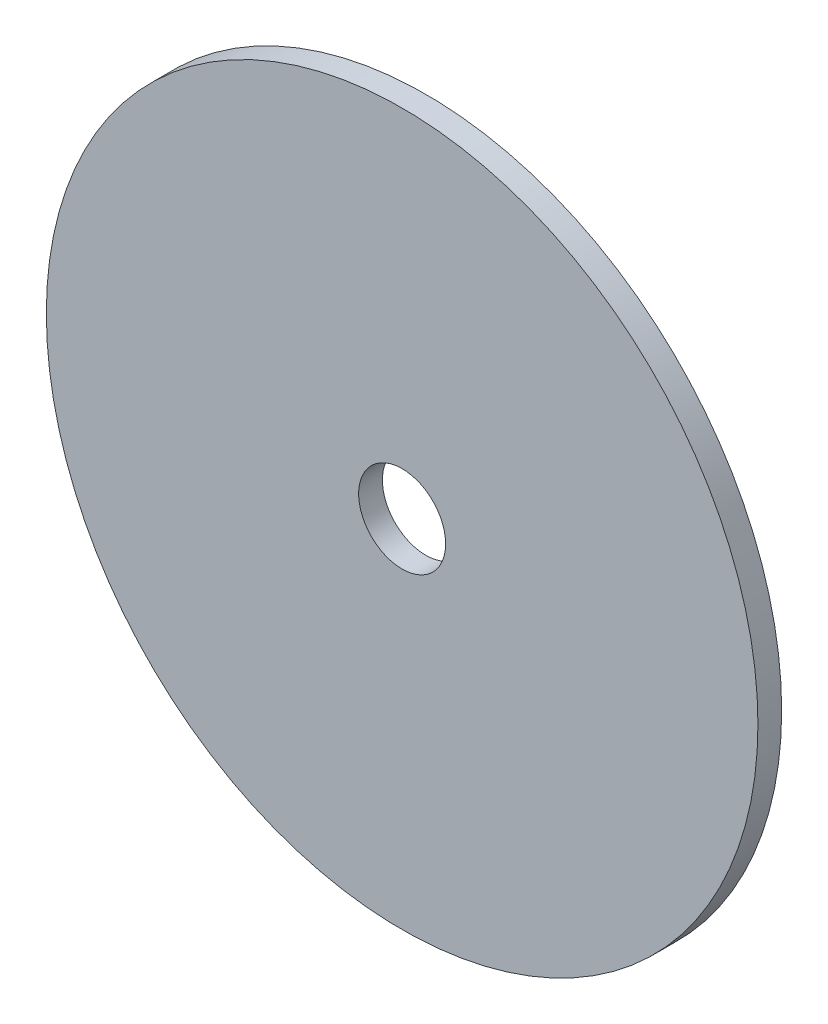
ISO-10303-21;
HEADER;
FILE_DESCRIPTION(('STEP AP214'),'2;1');
FILE_NAME('part.step','',(''),(''),'','','');
FILE_SCHEMA(('AUTOMOTIVE_DESIGN { 1 0 10303 214 1 1 1 1 }'));
ENDSEC;
DATA;
#1=APPLICATION_CONTEXT('core data for automotive mechanical design processes');
#2=APPLICATION_PROTOCOL_DEFINITION('international standard','automotive_design',2000,#1);
#3=PRODUCT_CONTEXT('',#1,'mechanical');
#4=PRODUCT('Part','Part','',(#3));
#5=PRODUCT_RELATED_PRODUCT_CATEGORY('part','',(#4));
#6=PRODUCT_DEFINITION_FORMATION('','',#4);
#7=PRODUCT_DEFINITION_CONTEXT('part definition',#1,'design');
#8=PRODUCT_DEFINITION('design','',#6,#7);
#9=PRODUCT_DEFINITION_SHAPE('','',#8);
#10=(LENGTH_UNIT() NAMED_UNIT(*) SI_UNIT(.MILLI.,.METRE.));
#11=(NAMED_UNIT(*) PLANE_ANGLE_UNIT() SI_UNIT($,.RADIAN.));
#12=(NAMED_UNIT(*) SI_UNIT($,.STERADIAN.) SOLID_ANGLE_UNIT());
#13=UNCERTAINTY_MEASURE_WITH_UNIT(LENGTH_MEASURE(1.E-05),#10,'distance_accuracy_value','');
#14=(GEOMETRIC_REPRESENTATION_CONTEXT(3) GLOBAL_UNCERTAINTY_ASSIGNED_CONTEXT((#13)) GLOBAL_UNIT_ASSIGNED_CONTEXT((#10,
#11,#12)) REPRESENTATION_CONTEXT('',''));
#15=CARTESIAN_POINT('',(0.,0.,0.));
#16=DIRECTION('',(0.,0.,1.));
#17=DIRECTION('',(1.,0.,0.));
#18=AXIS2_PLACEMENT_3D('',#15,#16,#17);
#19=CARTESIAN_POINT('',(0.,0.,1.5));
#20=DIRECTION('',(0.,0.,1.));
#21=DIRECTION('',(1.,0.,0.));
#22=AXIS2_PLACEMENT_3D('',#19,#20,#21);
#23=PLANE('',#22);
#24=CARTESIAN_POINT('',(0.,0.,1.5));
#25=DIRECTION('',(0.,0.,1.));
#26=DIRECTION('',(1.,0.,0.));
#27=AXIS2_PLACEMENT_3D('',#24,#25,#26);
#28=CIRCLE('',#27,22.5);
#29=CARTESIAN_POINT('',(22.5,0.,1.5));
#30=VERTEX_POINT('',#29);
#31=EDGE_CURVE('E10',#30,#30,#28,.T.);
#32=ORIENTED_EDGE('',*,*,#31,.T.);
#33=EDGE_LOOP('',(#32));
#34=FACE_BOUND('',#33,.T.);
#35=CARTESIAN_POINT('',(0.,0.,1.5));
#36=DIRECTION('',(0.,0.,1.));
#37=DIRECTION('',(1.,0.,0.));
#38=AXIS2_PLACEMENT_3D('',#35,#36,#37);
#39=CIRCLE('',#38,2.75);
#40=CARTESIAN_POINT('',(2.75,0.,1.5));
#41=VERTEX_POINT('',#40);
#42=EDGE_CURVE('E40',#41,#41,#39,.T.);
#43=ORIENTED_EDGE('',*,*,#42,.F.);
#44=EDGE_LOOP('',(#43));
#45=FACE_BOUND('',#44,.T.);
#46=ADVANCED_FACE('F29',(#34,#45),#23,.T.);
#47=CARTESIAN_POINT('',(0.,0.,0.));
#48=DIRECTION('',(0.,0.,1.));
#49=DIRECTION('',(1.,0.,0.));
#50=AXIS2_PLACEMENT_3D('',#47,#48,#49);
#51=PLANE('',#50);
#52=CARTESIAN_POINT('',(0.,0.,0.));
#53=DIRECTION('',(0.,0.,1.));
#54=DIRECTION('',(1.,0.,0.));
#55=AXIS2_PLACEMENT_3D('',#52,#53,#54);
#56=CIRCLE('',#55,22.5);
#57=CARTESIAN_POINT('',(22.5,0.,0.));
#58=VERTEX_POINT('',#57);
#59=EDGE_CURVE('E33',#58,#58,#56,.T.);
#60=ORIENTED_EDGE('',*,*,#59,.F.);
#61=EDGE_LOOP('',(#60));
#62=FACE_BOUND('',#61,.T.);
#63=CARTESIAN_POINT('',(0.,0.,0.));
#64=DIRECTION('',(0.,0.,1.));
#65=DIRECTION('',(1.,0.,0.));
#66=AXIS2_PLACEMENT_3D('',#63,#64,#65);
#67=CIRCLE('',#66,2.75);
#68=CARTESIAN_POINT('',(2.75,0.,0.));
#69=VERTEX_POINT('',#68);
#70=EDGE_CURVE('E42',#69,#69,#67,.T.);
#71=ORIENTED_EDGE('',*,*,#70,.T.);
#72=EDGE_LOOP('',(#71));
#73=FACE_BOUND('',#72,.T.);
#74=ADVANCED_FACE('F52',(#62,#73),#51,.F.);
#75=CARTESIAN_POINT('',(0.,0.,1.5));
#76=DIRECTION('',(0.,0.,-1.));
#77=DIRECTION('',(-1.,0.,0.));
#78=AXIS2_PLACEMENT_3D('',#75,#76,#77);
#79=CYLINDRICAL_SURFACE('',#78,22.5);
#80=ORIENTED_EDGE('',*,*,#31,.F.);
#81=EDGE_LOOP('',(#80));
#82=FACE_BOUND('',#81,.T.);
#83=ORIENTED_EDGE('',*,*,#59,.T.);
#84=EDGE_LOOP('',(#83));
#85=FACE_BOUND('',#84,.T.);
#86=ADVANCED_FACE('F31',(#82,#85),#79,.T.);
#87=CARTESIAN_POINT('',(0.,0.,1.5));
#88=DIRECTION('',(0.,0.,-1.));
#89=DIRECTION('',(-1.,0.,0.));
#90=AXIS2_PLACEMENT_3D('',#87,#88,#89);
#91=CYLINDRICAL_SURFACE('',#90,2.75);
#92=ORIENTED_EDGE('',*,*,#42,.T.);
#93=EDGE_LOOP('',(#92));
#94=FACE_BOUND('',#93,.T.);
#95=ORIENTED_EDGE('',*,*,#70,.F.);
#96=EDGE_LOOP('',(#95));
#97=FACE_BOUND('',#96,.T.);
#98=ADVANCED_FACE('F48',(#94,#97),#91,.F.);
#99=CLOSED_SHELL('',(#46,#74,#86,#98));
#100=MANIFOLD_SOLID_BREP('B2',#99);
#101=ADVANCED_BREP_SHAPE_REPRESENTATION('',(#18,#100),#14);
#102=SHAPE_DEFINITION_REPRESENTATION(#9,#101);
ENDSEC;
END-ISO-10303-21;
